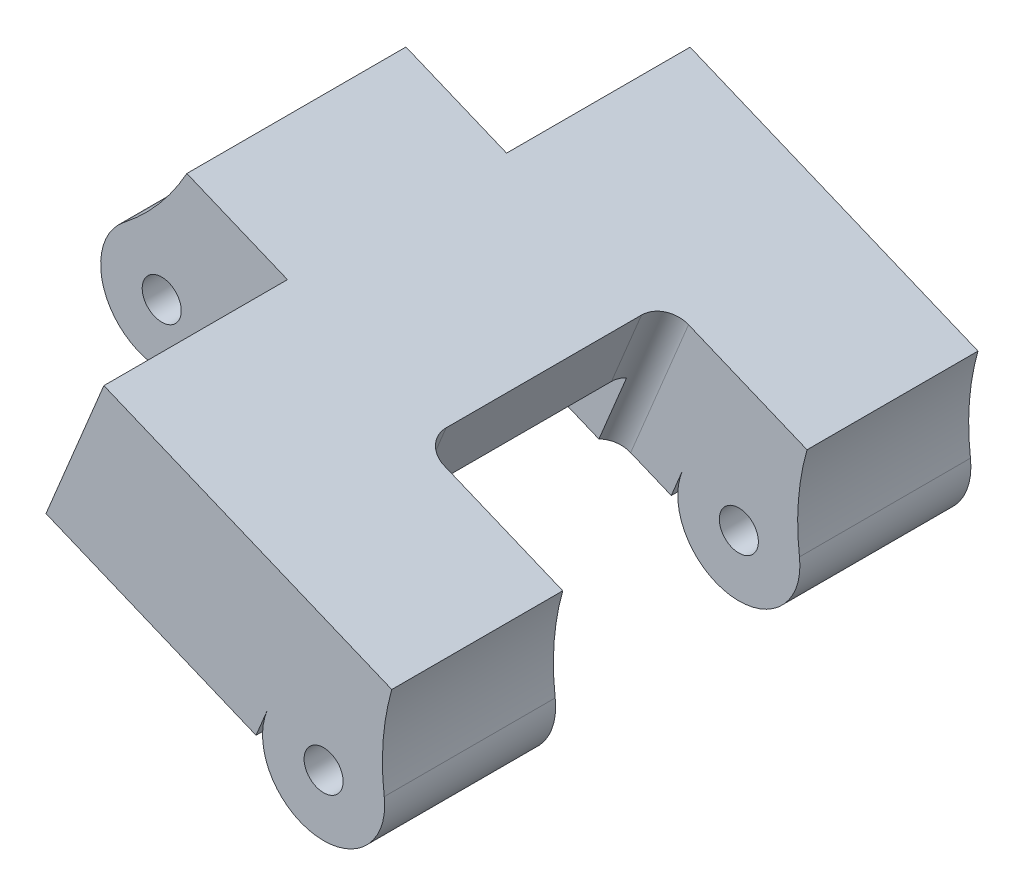
ISO-10303-21;
HEADER;
FILE_DESCRIPTION(('STEP AP214'),'2;1');
FILE_NAME('part.step','',(''),(''),'','','');
FILE_SCHEMA(('AUTOMOTIVE_DESIGN { 1 0 10303 214 1 1 1 1 }'));
ENDSEC;
DATA;
#1=APPLICATION_CONTEXT('core data for automotive mechanical design processes');
#2=APPLICATION_PROTOCOL_DEFINITION('international standard','automotive_design',2000,#1);
#3=PRODUCT_CONTEXT('',#1,'mechanical');
#4=PRODUCT('Part','Part','',(#3));
#5=PRODUCT_RELATED_PRODUCT_CATEGORY('part','',(#4));
#6=PRODUCT_DEFINITION_FORMATION('','',#4);
#7=PRODUCT_DEFINITION_CONTEXT('part definition',#1,'design');
#8=PRODUCT_DEFINITION('design','',#6,#7);
#9=PRODUCT_DEFINITION_SHAPE('','',#8);
#10=(LENGTH_UNIT() NAMED_UNIT(*) SI_UNIT(.MILLI.,.METRE.));
#11=(NAMED_UNIT(*) PLANE_ANGLE_UNIT() SI_UNIT($,.RADIAN.));
#12=(NAMED_UNIT(*) SI_UNIT($,.STERADIAN.) SOLID_ANGLE_UNIT());
#13=UNCERTAINTY_MEASURE_WITH_UNIT(LENGTH_MEASURE(1.E-05),#10,'distance_accuracy_value','');
#14=(GEOMETRIC_REPRESENTATION_CONTEXT(3) GLOBAL_UNCERTAINTY_ASSIGNED_CONTEXT((#13)) GLOBAL_UNIT_ASSIGNED_CONTEXT((#10,
#11,#12)) REPRESENTATION_CONTEXT('',''));
#15=CARTESIAN_POINT('',(0.,0.,0.));
#16=DIRECTION('',(0.,0.,1.));
#17=DIRECTION('',(1.,0.,0.));
#18=AXIS2_PLACEMENT_3D('',#15,#16,#17);
#19=CARTESIAN_POINT('',(-0.172591986233107,-0.248532460175933,-16.));
#20=DIRECTION('',(0.,0.,1.));
#21=DIRECTION('',(1.,0.,0.));
#22=AXIS2_PLACEMENT_3D('',#19,#20,#21);
#23=CYLINDRICAL_SURFACE('',#22,20.7025828439832);
#24=CARTESIAN_POINT('',(-0.172591986233206,-0.248532460176063,0.5));
#25=DIRECTION('',(0.,0.,-1.));
#26=DIRECTION('',(1.,0.,0.));
#27=AXIS2_PLACEMENT_3D('',#24,#25,#26);
#28=CIRCLE('',#27,20.7025828439833);
#29=CARTESIAN_POINT('',(3.81573033422418,20.0662459407845,0.5));
#30=VERTEX_POINT('',#29);
#31=CARTESIAN_POINT('',(10.0472090165968,17.7557060373152,0.5));
#32=VERTEX_POINT('',#31);
#33=EDGE_CURVE('E264',#30,#32,#28,.T.);
#34=ORIENTED_EDGE('',*,*,#33,.F.);
#35=DIRECTION('',(0.,0.,1.));
#36=VECTOR('',#35,1.);
#37=CARTESIAN_POINT('',(3.81573033422417,20.0662459407845,-16.));
#38=LINE('',#37,#36);
#39=CARTESIAN_POINT('',(3.81573033422417,20.0662459407845,-8.5));
#40=VERTEX_POINT('',#39);
#41=EDGE_CURVE('E299',#40,#30,#38,.T.);
#42=ORIENTED_EDGE('',*,*,#41,.F.);
#43=CARTESIAN_POINT('',(-0.172591986234314,-0.248532460179092,-8.5));
#44=DIRECTION('',(0.,0.,1.));
#45=DIRECTION('',(1.,0.,0.));
#46=AXIS2_PLACEMENT_3D('',#43,#44,#45);
#47=CIRCLE('',#46,20.7025828439865);
#48=CARTESIAN_POINT('',(10.0472090165968,17.7557060373152,-8.5));
#49=VERTEX_POINT('',#48);
#50=EDGE_CURVE('E270',#49,#40,#47,.T.);
#51=ORIENTED_EDGE('',*,*,#50,.F.);
#52=CARTESIAN_POINT('',(10.0472090165968,17.7557060373152,-8.5));
#53=CARTESIAN_POINT('',(10.0348468425671,17.7627230248372,-8.47556494491459));
#54=CARTESIAN_POINT('',(10.0233881818708,17.7692107344771,-8.45054041542161));
#55=CARTESIAN_POINT('',(10.0023496405759,17.7810999899579,-8.39945588872322));
#56=CARTESIAN_POINT('',(9.99277030420811,17.7865012211786,-8.37339559419182));
#57=CARTESIAN_POINT('',(9.96735973518549,17.8008080954167,-8.29510225224552));
#58=CARTESIAN_POINT('',(9.95428926434468,17.8081373751284,-8.24163153746031));
#59=CARTESIAN_POINT('',(9.94004860241634,17.8161144802811,-8.15667965278405));
#60=CARTESIAN_POINT('',(9.93617506017608,17.8182818492101,-8.12575053117395));
#61=CARTESIAN_POINT('',(9.93095008808091,17.8212040555584,-8.06322350599761));
#62=CARTESIAN_POINT('',(9.92963078179481,17.8219409022057,-8.03162207501034));
#63=CARTESIAN_POINT('',(9.92963074491732,17.8219415873474,-8.));
#64=B_SPLINE_CURVE_WITH_KNOTS('',3,(#52,#53,#54,#55,#56,#57,#58,#59,#60,#61,#62,#63),
.UNSPECIFIED.,.F.,.F.,(4,2,2,2,2,4),(0.,0.0847472981534116,0.169519102046933,0.33521086431693,
0.428830058402456,0.5236192036868),.UNSPECIFIED.);
#65=CARTESIAN_POINT('',(9.92963074491732,17.8219415873474,-8.));
#66=VERTEX_POINT('',#65);
#67=EDGE_CURVE('E414',#49,#66,#64,.T.);
#68=ORIENTED_EDGE('',*,*,#67,.T.);
#69=DIRECTION('',(0.,0.,1.));
#70=VECTOR('',#69,1.);
#71=CARTESIAN_POINT('',(9.92963074491732,17.8219415873474,-16.));
#72=LINE('',#71,#70);
#73=CARTESIAN_POINT('',(9.92963074491732,17.8219415873474,0.));
#74=VERTEX_POINT('',#73);
#75=EDGE_CURVE('E296',#74,#66,#72,.F.);
#76=ORIENTED_EDGE('',*,*,#75,.F.);
#77=CARTESIAN_POINT('',(9.92963074491732,17.8219415873474,0.));
#78=CARTESIAN_POINT('',(9.92963154305127,17.8219407458761,0.028268848097725));
#79=CARTESIAN_POINT('',(9.93068520822844,17.8213521357923,0.0565204675716787));
#80=CARTESIAN_POINT('',(9.93488853924816,17.8190014742105,0.112825718695898));
#81=CARTESIAN_POINT('',(9.93803876205039,17.8172391108997,0.140879295733458));
#82=CARTESIAN_POINT('',(9.95042845900294,17.8103015950477,0.223210007944532));
#83=CARTESIAN_POINT('',(9.96261005720908,17.8034745668824,0.276955869003455));
#84=CARTESIAN_POINT('',(9.98757688553737,17.7894277374939,0.358581067899168));
#85=CARTESIAN_POINT('',(9.99779496816211,17.7836703569581,0.387543206524583));
#86=CARTESIAN_POINT('',(10.020681794944,17.770742737753,0.444593669477878));
#87=CARTESIAN_POINT('',(10.0333795519744,17.763555751717,0.472666563127197));
#88=CARTESIAN_POINT('',(10.0472090165968,17.7557060373152,0.499999999999999));
#89=B_SPLINE_CURVE_WITH_KNOTS('',3,(#77,#78,#79,#80,#81,#82,#83,#84,#85,#86,#87,#88),
.UNSPECIFIED.,.F.,.F.,(4,2,2,2,2,4),(0.,0.0847465195713117,0.169515561415968,0.335205588174701,
0.42882778002787,0.523619233427886),.UNSPECIFIED.);
#90=EDGE_CURVE('E536',#74,#32,#89,.T.);
#91=ORIENTED_EDGE('',*,*,#90,.T.);
#92=EDGE_LOOP('',(#34,#42,#51,#68,#76,#91));
#93=FACE_BOUND('',#92,.T.);
#94=ADVANCED_FACE('F40',(#93),#23,.F.);
#95=CARTESIAN_POINT('',(5.03679434741886,6.00791887752144,1.));
#96=DIRECTION('',(0.,0.,1.));
#97=DIRECTION('',(1.,0.,0.));
#98=AXIS2_PLACEMENT_3D('',#95,#96,#97);
#99=PLANE('',#98);
#100=DIRECTION('',(0.923898665528031,-0.382637237910168,0.));
#101=VECTOR('',#100,1.);
#102=CARTESIAN_POINT('',(11.1589901539816,20.7902975259699,1.));
#103=LINE('',#102,#101);
#104=CARTESIAN_POINT('',(12.0828888195096,20.4076602880598,1.));
#105=VERTEX_POINT('',#104);
#106=CARTESIAN_POINT('',(16.9333568135318,18.3988147890314,1.));
#107=VERTEX_POINT('',#106);
#108=EDGE_CURVE('E309',#105,#107,#103,.T.);
#109=ORIENTED_EDGE('',*,*,#108,.T.);
#110=CARTESIAN_POINT('',(26.5503089133486,15.6576047806906,1.));
#111=DIRECTION('',(0.,0.,1.));
#112=DIRECTION('',(1.,0.,0.));
#113=AXIS2_PLACEMENT_3D('',#110,#111,#112);
#114=CIRCLE('',#113,10.);
#115=CARTESIAN_POINT('',(16.6240045962296,14.4457951405478,1.));
#116=VERTEX_POINT('',#115);
#117=EDGE_CURVE('E390',#107,#116,#114,.T.);
#118=ORIENTED_EDGE('',*,*,#117,.T.);
#119=CARTESIAN_POINT('',(14.1424285169498,14.1428427305121,1.));
#120=DIRECTION('',(0.,0.,1.));
#121=DIRECTION('',(1.,0.,0.));
#122=AXIS2_PLACEMENT_3D('',#119,#120,#121);
#123=CIRCLE('',#122,2.5);
#124=CARTESIAN_POINT('',(11.8326818531297,15.0994358252875,1.));
#125=VERTEX_POINT('',#124);
#126=EDGE_CURVE('E315',#125,#116,#123,.T.);
#127=ORIENTED_EDGE('',*,*,#126,.F.);
#128=DIRECTION('',(-0.382637237910168,-0.923898665528032,0.));
#129=VECTOR('',#128,1.);
#130=CARTESIAN_POINT('',(11.8326818531297,15.0994358252875,1.));
#131=LINE('',#130,#129);
#132=CARTESIAN_POINT('',(11.3762448195379,13.9973434922564,1.));
#133=VERTEX_POINT('',#132);
#134=EDGE_CURVE('E238',#125,#133,#131,.T.);
#135=ORIENTED_EDGE('',*,*,#134,.T.);
#136=DIRECTION('',(0.923898665528031,-0.382637237910168,0.));
#137=VECTOR('',#136,1.);
#138=CARTESIAN_POINT('',(14.5637335903891,12.6772291283601,1.));
#139=LINE('',#138,#137);
#140=CARTESIAN_POINT('',(9.71326559636697,14.6860746273885,1.));
#141=VERTEX_POINT('',#140);
#142=EDGE_CURVE('E231',#141,#133,#139,.T.);
#143=ORIENTED_EDGE('',*,*,#142,.F.);
#144=DIRECTION('',(0.382637237910168,0.923898665528031,0.));
#145=VECTOR('',#144,1.);
#146=CARTESIAN_POINT('',(12.0828888195096,20.4076602880598,1.));
#147=LINE('',#146,#145);
#148=EDGE_CURVE('E56',#141,#105,#147,.T.);
#149=ORIENTED_EDGE('',*,*,#148,.T.);
#150=EDGE_LOOP('',(#109,#118,#127,#135,#143,#149));
#151=FACE_BOUND('',#150,.T.);
#152=CARTESIAN_POINT('',(14.1424285169498,14.1428427305121,1.));
#153=DIRECTION('',(0.,0.,1.));
#154=DIRECTION('',(1.,0.,0.));
#155=AXIS2_PLACEMENT_3D('',#152,#153,#154);
#156=CIRCLE('',#155,0.800000000000001);
#157=CARTESIAN_POINT('',(14.9424285169498,14.1428427305121,1.));
#158=VERTEX_POINT('',#157);
#159=EDGE_CURVE('E314',#158,#158,#156,.T.);
#160=ORIENTED_EDGE('',*,*,#159,.T.);
#161=EDGE_LOOP('',(#160));
#162=FACE_BOUND('',#161,.T.);
#163=ADVANCED_FACE('F488',(#151,#162),#99,.F.);
#164=CARTESIAN_POINT('',(5.03679434741886,6.00791887752144,-9.));
#165=DIRECTION('',(0.,0.,-1.));
#166=DIRECTION('',(-1.,0.,0.));
#167=AXIS2_PLACEMENT_3D('',#164,#165,#166);
#168=PLANE('',#167);
#169=CARTESIAN_POINT('',(26.5503089133486,15.6576047806906,-9.));
#170=DIRECTION('',(0.,0.,-1.));
#171=DIRECTION('',(-1.,0.,0.));
#172=AXIS2_PLACEMENT_3D('',#169,#170,#171);
#173=CIRCLE('',#172,10.);
#174=CARTESIAN_POINT('',(16.6240045962296,14.4457951405478,-9.));
#175=VERTEX_POINT('',#174);
#176=CARTESIAN_POINT('',(16.9333568135318,18.3988147890314,-9.));
#177=VERTEX_POINT('',#176);
#178=EDGE_CURVE('E397',#175,#177,#173,.T.);
#179=ORIENTED_EDGE('',*,*,#178,.T.);
#180=DIRECTION('',(-0.923898665528031,0.382637237910168,0.));
#181=VECTOR('',#180,1.);
#182=CARTESIAN_POINT('',(11.1589901539816,20.7902975259699,-9.));
#183=LINE('',#182,#181);
#184=CARTESIAN_POINT('',(12.0828888195096,20.4076602880598,-9.));
#185=VERTEX_POINT('',#184);
#186=EDGE_CURVE('E213',#177,#185,#183,.T.);
#187=ORIENTED_EDGE('',*,*,#186,.T.);
#188=DIRECTION('',(0.382637237910168,0.923898665528031,0.));
#189=VECTOR('',#188,1.);
#190=CARTESIAN_POINT('',(10.1697026299587,15.7881669604196,-9.));
#191=LINE('',#190,#189);
#192=CARTESIAN_POINT('',(9.71326559636697,14.6860746273885,-9.));
#193=VERTEX_POINT('',#192);
#194=EDGE_CURVE('E208',#185,#193,#191,.F.);
#195=ORIENTED_EDGE('',*,*,#194,.T.);
#196=DIRECTION('',(-0.923898665528031,0.382637237910168,0.));
#197=VECTOR('',#196,1.);
#198=CARTESIAN_POINT('',(9.71326559636697,14.6860746273885,-9.));
#199=LINE('',#198,#197);
#200=CARTESIAN_POINT('',(11.3762448195379,13.9973434922564,-9.));
#201=VERTEX_POINT('',#200);
#202=EDGE_CURVE('E63',#201,#193,#199,.T.);
#203=ORIENTED_EDGE('',*,*,#202,.F.);
#204=DIRECTION('',(0.382637237910168,0.923898665528032,0.));
#205=VECTOR('',#204,1.);
#206=CARTESIAN_POINT('',(11.3762448195379,13.9973434922564,-9.));
#207=LINE('',#206,#205);
#208=CARTESIAN_POINT('',(11.8326818531297,15.0994358252875,-9.));
#209=VERTEX_POINT('',#208);
#210=EDGE_CURVE('E11',#201,#209,#207,.T.);
#211=ORIENTED_EDGE('',*,*,#210,.T.);
#212=CARTESIAN_POINT('',(14.1424285169498,14.1428427305121,-9.));
#213=DIRECTION('',(0.,0.,-1.));
#214=DIRECTION('',(-1.,0.,0.));
#215=AXIS2_PLACEMENT_3D('',#212,#213,#214);
#216=CIRCLE('',#215,2.5);
#217=EDGE_CURVE('E312',#175,#209,#216,.T.);
#218=ORIENTED_EDGE('',*,*,#217,.F.);
#219=EDGE_LOOP('',(#179,#187,#195,#203,#211,#218));
#220=FACE_BOUND('',#219,.T.);
#221=CARTESIAN_POINT('',(14.1424285169498,14.1428427305121,-9.));
#222=DIRECTION('',(0.,0.,-1.));
#223=DIRECTION('',(-1.,0.,0.));
#224=AXIS2_PLACEMENT_3D('',#221,#222,#223);
#225=CIRCLE('',#224,0.800000000000001);
#226=CARTESIAN_POINT('',(13.3424285169498,14.1428427305121,-9.));
#227=VERTEX_POINT('',#226);
#228=EDGE_CURVE('E311',#227,#227,#225,.T.);
#229=ORIENTED_EDGE('',*,*,#228,.T.);
#230=EDGE_LOOP('',(#229));
#231=FACE_BOUND('',#230,.T.);
#232=ADVANCED_FACE('F210',(#220,#231),#168,.F.);
#233=CARTESIAN_POINT('',(14.1424285169498,14.1428427305121,8.));
#234=DIRECTION('',(0.,0.,-1.));
#235=DIRECTION('',(-1.,0.,0.));
#236=AXIS2_PLACEMENT_3D('',#233,#234,#235);
#237=CYLINDRICAL_SURFACE('',#236,2.5);
#238=ORIENTED_EDGE('',*,*,#126,.T.);
#239=DIRECTION('',(0.,0.,-1.));
#240=VECTOR('',#239,1.);
#241=CARTESIAN_POINT('',(16.6240045962296,14.4457951405478,8.));
#242=LINE('',#241,#240);
#243=CARTESIAN_POINT('',(16.6240045962296,14.4457951405478,8.));
#244=VERTEX_POINT('',#243);
#245=EDGE_CURVE('E379',#116,#244,#242,.F.);
#246=ORIENTED_EDGE('',*,*,#245,.T.);
#247=CARTESIAN_POINT('',(14.1424285169498,14.1428427305121,8.));
#248=DIRECTION('',(0.,0.,1.));
#249=DIRECTION('',(1.,0.,0.));
#250=AXIS2_PLACEMENT_3D('',#247,#248,#249);
#251=CIRCLE('',#250,2.5);
#252=CARTESIAN_POINT('',(11.8326818531297,15.0994358252875,8.));
#253=VERTEX_POINT('',#252);
#254=EDGE_CURVE('E350',#253,#244,#251,.T.);
#255=ORIENTED_EDGE('',*,*,#254,.F.);
#256=DIRECTION('',(0.,0.,-1.));
#257=VECTOR('',#256,1.);
#258=CARTESIAN_POINT('',(11.8326818531297,15.0994358252875,8.));
#259=LINE('',#258,#257);
#260=EDGE_CURVE('E366',#253,#125,#259,.T.);
#261=ORIENTED_EDGE('',*,*,#260,.T.);
#262=EDGE_LOOP('',(#238,#246,#255,#261));
#263=FACE_BOUND('',#262,.T.);
#264=ADVANCED_FACE('F460',(#263),#237,.T.);
#265=CARTESIAN_POINT('',(14.1424285169498,14.1428427305121,8.));
#266=DIRECTION('',(0.,0.,-1.));
#267=DIRECTION('',(-1.,0.,0.));
#268=AXIS2_PLACEMENT_3D('',#265,#266,#267);
#269=CYLINDRICAL_SURFACE('',#268,0.800000000000001);
#270=ORIENTED_EDGE('',*,*,#159,.F.);
#271=EDGE_LOOP('',(#270));
#272=FACE_BOUND('',#271,.T.);
#273=CARTESIAN_POINT('',(14.1424285169498,14.1428427305121,8.));
#274=DIRECTION('',(0.,0.,1.));
#275=DIRECTION('',(1.,0.,0.));
#276=AXIS2_PLACEMENT_3D('',#273,#274,#275);
#277=CIRCLE('',#276,0.800000000000001);
#278=CARTESIAN_POINT('',(14.9424285169498,14.1428427305121,8.));
#279=VERTEX_POINT('',#278);
#280=EDGE_CURVE('E347',#279,#279,#277,.T.);
#281=ORIENTED_EDGE('',*,*,#280,.T.);
#282=EDGE_LOOP('',(#281));
#283=FACE_BOUND('',#282,.T.);
#284=ADVANCED_FACE('F450',(#272,#283),#269,.F.);
#285=CARTESIAN_POINT('',(14.1424285169498,14.1428427305121,-16.));
#286=DIRECTION('',(0.,0.,1.));
#287=DIRECTION('',(1.,0.,0.));
#288=AXIS2_PLACEMENT_3D('',#285,#286,#287);
#289=CIRCLE('',#288,2.5);
#290=CARTESIAN_POINT('',(11.8326818531297,15.0994358252875,-16.));
#291=VERTEX_POINT('',#290);
#292=CARTESIAN_POINT('',(16.6240045962296,14.4457951405478,-16.));
#293=VERTEX_POINT('',#292);
#294=EDGE_CURVE('E341',#291,#293,#289,.T.);
#295=ORIENTED_EDGE('',*,*,#294,.T.);
#296=DIRECTION('',(0.,0.,-1.));
#297=VECTOR('',#296,1.);
#298=CARTESIAN_POINT('',(16.6240045962296,14.4457951405478,8.));
#299=LINE('',#298,#297);
#300=EDGE_CURVE('E385',#293,#175,#299,.F.);
#301=ORIENTED_EDGE('',*,*,#300,.T.);
#302=ORIENTED_EDGE('',*,*,#217,.T.);
#303=EDGE_CURVE('E365',#209,#291,#259,.T.);
#304=ORIENTED_EDGE('',*,*,#303,.T.);
#305=EDGE_LOOP('',(#295,#301,#302,#304));
#306=FACE_BOUND('',#305,.T.);
#307=ADVANCED_FACE('F456',(#306),#237,.T.);
#308=CARTESIAN_POINT('',(8.98354685928157,21.6912682109297,8.));
#309=DIRECTION('',(0.382637237910168,0.923898665528031,0.));
#310=DIRECTION('',(-0.923898665528031,0.382637237910168,0.));
#311=AXIS2_PLACEMENT_3D('',#308,#309,#310);
#312=PLANE('',#311);
#313=ORIENTED_EDGE('',*,*,#108,.F.);
#314=CARTESIAN_POINT('',(12.0828888195096,20.4076602880598,0.));
#315=DIRECTION('',(0.382637237910168,0.923898665528031,0.));
#316=DIRECTION('',(-0.923898665528031,0.382637237910168,0.));
#317=AXIS2_PLACEMENT_3D('',#314,#315,#316);
#318=CIRCLE('',#317,1.);
#319=CARTESIAN_POINT('',(11.1589901539816,20.7902975259699,0.));
#320=VERTEX_POINT('',#319);
#321=EDGE_CURVE('E421',#105,#320,#318,.F.);
#322=ORIENTED_EDGE('',*,*,#321,.T.);
#323=DIRECTION('',(0.,0.,1.));
#324=VECTOR('',#323,1.);
#325=CARTESIAN_POINT('',(11.1589901539816,20.7902975259699,1.));
#326=LINE('',#325,#324);
#327=CARTESIAN_POINT('',(11.1589901539816,20.7902975259699,-8.));
#328=VERTEX_POINT('',#327);
#329=EDGE_CURVE('E306',#328,#320,#326,.T.);
#330=ORIENTED_EDGE('',*,*,#329,.F.);
#331=CARTESIAN_POINT('',(12.0828888195096,20.4076602880598,-8.));
#332=DIRECTION('',(0.382637237910168,0.923898665528031,0.));
#333=DIRECTION('',(-0.923898665528031,0.382637237910168,0.));
#334=AXIS2_PLACEMENT_3D('',#331,#332,#333);
#335=CIRCLE('',#334,1.);
#336=EDGE_CURVE('E411',#328,#185,#335,.F.);
#337=ORIENTED_EDGE('',*,*,#336,.T.);
#338=ORIENTED_EDGE('',*,*,#186,.F.);
#339=DIRECTION('',(0.,0.,-1.));
#340=VECTOR('',#339,1.);
#341=CARTESIAN_POINT('',(16.9333568135318,18.3988147890314,8.));
#342=LINE('',#341,#340);
#343=CARTESIAN_POINT('',(16.9333568135318,18.3988147890314,-16.));
#344=VERTEX_POINT('',#343);
#345=EDGE_CURVE('E361',#177,#344,#342,.T.);
#346=ORIENTED_EDGE('',*,*,#345,.T.);
#347=DIRECTION('',(0.923898665528032,-0.382637237910168,0.));
#348=VECTOR('',#347,1.);
#349=CARTESIAN_POINT('',(8.98354685928157,21.6912682109297,-16.));
#350=LINE('',#349,#348);
#351=CARTESIAN_POINT('',(5.14683151889894,23.2802629949546,-16.));
#352=VERTEX_POINT('',#351);
#353=EDGE_CURVE('E344',#352,#344,#350,.T.);
#354=ORIENTED_EDGE('',*,*,#353,.F.);
#355=DIRECTION('',(0.,0.,-1.));
#356=VECTOR('',#355,1.);
#357=CARTESIAN_POINT('',(5.14683151889895,23.2802629949546,-16.));
#358=LINE('',#357,#356);
#359=CARTESIAN_POINT('',(5.14683151889895,23.2802629949546,-8.48506014245602));
#360=VERTEX_POINT('',#359);
#361=EDGE_CURVE('E317',#360,#352,#358,.T.);
#362=ORIENTED_EDGE('',*,*,#361,.F.);
#363=DIRECTION('',(0.923898665528031,-0.382637237910168,0.));
#364=VECTOR('',#363,1.);
#365=CARTESIAN_POINT('',(5.14683151889895,23.2802629949546,-8.48506014245602));
#366=LINE('',#365,#364);
#367=CARTESIAN_POINT('',(1.0293911058345,24.985521467229,-8.48506014245602));
#368=VERTEX_POINT('',#367);
#369=EDGE_CURVE('E329',#368,#360,#366,.T.);
#370=ORIENTED_EDGE('',*,*,#369,.F.);
#371=DIRECTION('',(0.,0.,-1.));
#372=VECTOR('',#371,1.);
#373=CARTESIAN_POINT('',(1.02939110583451,24.985521467229,8.));
#374=LINE('',#373,#372);
#375=CARTESIAN_POINT('',(1.0293911058345,24.985521467229,0.485060142456018));
#376=VERTEX_POINT('',#375);
#377=EDGE_CURVE('E358',#376,#368,#374,.T.);
#378=ORIENTED_EDGE('',*,*,#377,.F.);
#379=DIRECTION('',(-0.923898665528031,0.382637237910168,0.));
#380=VECTOR('',#379,1.);
#381=CARTESIAN_POINT('',(5.14683151889895,23.2802629949546,0.485060142456017));
#382=LINE('',#381,#380);
#383=CARTESIAN_POINT('',(5.14683151889895,23.2802629949546,0.485060142456017));
#384=VERTEX_POINT('',#383);
#385=EDGE_CURVE('E321',#384,#376,#382,.T.);
#386=ORIENTED_EDGE('',*,*,#385,.F.);
#387=DIRECTION('',(0.,0.,-1.));
#388=VECTOR('',#387,1.);
#389=CARTESIAN_POINT('',(5.14683151889895,23.2802629949546,8.));
#390=LINE('',#389,#388);
#391=CARTESIAN_POINT('',(5.14683151889895,23.2802629949546,8.));
#392=VERTEX_POINT('',#391);
#393=EDGE_CURVE('E318',#392,#384,#390,.T.);
#394=ORIENTED_EDGE('',*,*,#393,.F.);
#395=DIRECTION('',(0.923898665528032,-0.382637237910168,0.));
#396=VECTOR('',#395,1.);
#397=CARTESIAN_POINT('',(8.98354685928157,21.6912682109297,8.));
#398=LINE('',#397,#396);
#399=CARTESIAN_POINT('',(16.9333568135318,18.3988147890314,8.));
#400=VERTEX_POINT('',#399);
#401=EDGE_CURVE('E353',#392,#400,#398,.T.);
#402=ORIENTED_EDGE('',*,*,#401,.T.);
#403=EDGE_CURVE('E362',#400,#107,#342,.T.);
#404=ORIENTED_EDGE('',*,*,#403,.T.);
#405=EDGE_LOOP('',(#313,#322,#330,#337,#338,#346,#354,#362,#370,#378,#386,#394,#402,#404));
#406=FACE_BOUND('',#405,.T.);
#407=ADVANCED_FACE('F448',(#406),#312,.T.);
#408=ORIENTED_EDGE('',*,*,#228,.F.);
#409=EDGE_LOOP('',(#408));
#410=FACE_BOUND('',#409,.T.);
#411=CARTESIAN_POINT('',(14.1424285169498,14.1428427305121,-16.));
#412=DIRECTION('',(0.,0.,1.));
#413=DIRECTION('',(1.,0.,0.));
#414=AXIS2_PLACEMENT_3D('',#411,#412,#413);
#415=CIRCLE('',#414,0.800000000000001);
#416=CARTESIAN_POINT('',(14.9424285169498,14.1428427305121,-16.));
#417=VERTEX_POINT('',#416);
#418=EDGE_CURVE('E338',#417,#417,#415,.T.);
#419=ORIENTED_EDGE('',*,*,#418,.F.);
#420=EDGE_LOOP('',(#419));
#421=FACE_BOUND('',#420,.T.);
#422=ADVANCED_FACE('F444',(#410,#421),#269,.F.);
#423=CARTESIAN_POINT('',(0.,20.,8.));
#424=DIRECTION('',(0.,0.,-1.));
#425=DIRECTION('',(-1.,0.,0.));
#426=AXIS2_PLACEMENT_3D('',#423,#424,#425);
#427=CYLINDRICAL_SURFACE('',#426,2.5);
#428=CARTESIAN_POINT('',(0.,20.,0.485060142456018));
#429=DIRECTION('',(0.,0.,-1.));
#430=DIRECTION('',(-1.,0.,0.));
#431=AXIS2_PLACEMENT_3D('',#428,#429,#430);
#432=CIRCLE('',#431,2.5);
#433=CARTESIAN_POINT('',(2.30974666382008,19.0434069052246,0.485060142456018));
#434=VERTEX_POINT('',#433);
#435=CARTESIAN_POINT('',(-1.5433525212549,21.9667391782176,0.485060142456018));
#436=VERTEX_POINT('',#435);
#437=EDGE_CURVE('E376',#434,#436,#432,.T.);
#438=ORIENTED_EDGE('',*,*,#437,.T.);
#439=DIRECTION('',(0.,0.,-1.));
#440=VECTOR('',#439,1.);
#441=CARTESIAN_POINT('',(-1.5433525212549,21.9667391782176,8.));
#442=LINE('',#441,#440);
#443=CARTESIAN_POINT('',(-1.5433525212549,21.9667391782176,-8.48506014245602));
#444=VERTEX_POINT('',#443);
#445=EDGE_CURVE('E387',#436,#444,#442,.T.);
#446=ORIENTED_EDGE('',*,*,#445,.T.);
#447=CARTESIAN_POINT('',(0.,20.,-8.48506014245602));
#448=DIRECTION('',(0.,0.,1.));
#449=DIRECTION('',(1.,0.,0.));
#450=AXIS2_PLACEMENT_3D('',#447,#448,#449);
#451=CIRCLE('',#450,2.5);
#452=CARTESIAN_POINT('',(2.30974666382008,19.0434069052246,-8.48506014245602));
#453=VERTEX_POINT('',#452);
#454=EDGE_CURVE('E373',#444,#453,#451,.T.);
#455=ORIENTED_EDGE('',*,*,#454,.T.);
#456=DIRECTION('',(0.,0.,-1.));
#457=VECTOR('',#456,1.);
#458=CARTESIAN_POINT('',(2.30974666382008,19.0434069052246,8.));
#459=LINE('',#458,#457);
#460=EDGE_CURVE('E356',#434,#453,#459,.T.);
#461=ORIENTED_EDGE('',*,*,#460,.F.);
#462=EDGE_LOOP('',(#438,#446,#455,#461));
#463=FACE_BOUND('',#462,.T.);
#464=ADVANCED_FACE('F447',(#463),#427,.T.);
#465=CARTESIAN_POINT('',(0.,0.,8.));
#466=DIRECTION('',(0.,0.,1.));
#467=DIRECTION('',(1.,0.,0.));
#468=AXIS2_PLACEMENT_3D('',#465,#466,#467);
#469=PLANE('',#468);
#470=DIRECTION('',(0.382637237910168,0.923898665528031,0.));
#471=VECTOR('',#470,1.);
#472=CARTESIAN_POINT('',(-3.83671534038262,1.58899478402487,8.));
#473=LINE('',#472,#471);
#474=CARTESIAN_POINT('',(2.77720829575634,17.5586773342833,8.));
#475=VERTEX_POINT('',#474);
#476=EDGE_CURVE('E371',#475,#392,#473,.T.);
#477=ORIENTED_EDGE('',*,*,#476,.F.);
#478=DIRECTION('',(0.923898665528032,-0.382637237910168,0.));
#479=VECTOR('',#478,1.);
#480=CARTESIAN_POINT('',(11.3762448195379,13.9973434922564,8.));
#481=LINE('',#480,#479);
#482=CARTESIAN_POINT('',(11.3762448195379,13.9973434922564,8.));
#483=VERTEX_POINT('',#482);
#484=EDGE_CURVE('E251',#475,#483,#481,.T.);
#485=ORIENTED_EDGE('',*,*,#484,.T.);
#486=DIRECTION('',(0.382637237910168,0.923898665528031,0.));
#487=VECTOR('',#486,1.);
#488=CARTESIAN_POINT('',(11.8326818531297,15.0994358252875,8.));
#489=LINE('',#488,#487);
#490=EDGE_CURVE('E257',#483,#253,#489,.T.);
#491=ORIENTED_EDGE('',*,*,#490,.T.);
#492=ORIENTED_EDGE('',*,*,#254,.T.);
#493=CARTESIAN_POINT('',(26.5503089133486,15.6576047806906,8.));
#494=DIRECTION('',(0.,0.,1.));
#495=DIRECTION('',(1.,0.,0.));
#496=AXIS2_PLACEMENT_3D('',#493,#494,#495);
#497=CIRCLE('',#496,10.);
#498=EDGE_CURVE('E393',#244,#400,#497,.F.);
#499=ORIENTED_EDGE('',*,*,#498,.T.);
#500=ORIENTED_EDGE('',*,*,#401,.F.);
#501=EDGE_LOOP('',(#477,#485,#491,#492,#499,#500));
#502=FACE_BOUND('',#501,.T.);
#503=ORIENTED_EDGE('',*,*,#280,.F.);
#504=EDGE_LOOP('',(#503));
#505=FACE_BOUND('',#504,.T.);
#506=ADVANCED_FACE('F466',(#502,#505),#469,.T.);
#507=CARTESIAN_POINT('',(0.,0.,-16.));
#508=DIRECTION('',(0.,0.,1.));
#509=DIRECTION('',(1.,0.,0.));
#510=AXIS2_PLACEMENT_3D('',#507,#508,#509);
#511=PLANE('',#510);
#512=ORIENTED_EDGE('',*,*,#294,.F.);
#513=DIRECTION('',(-0.382637237910168,-0.923898665528031,0.));
#514=VECTOR('',#513,1.);
#515=CARTESIAN_POINT('',(11.3762448195379,13.9973434922564,-16.));
#516=LINE('',#515,#514);
#517=CARTESIAN_POINT('',(11.3762448195379,13.9973434922564,-16.));
#518=VERTEX_POINT('',#517);
#519=EDGE_CURVE('E240',#291,#518,#516,.T.);
#520=ORIENTED_EDGE('',*,*,#519,.T.);
#521=DIRECTION('',(-0.923898665528032,0.382637237910168,0.));
#522=VECTOR('',#521,1.);
#523=CARTESIAN_POINT('',(2.77720829575634,17.5586773342833,-16.));
#524=LINE('',#523,#522);
#525=CARTESIAN_POINT('',(2.77720829575634,17.5586773342833,-16.));
#526=VERTEX_POINT('',#525);
#527=EDGE_CURVE('E243',#518,#526,#524,.T.);
#528=ORIENTED_EDGE('',*,*,#527,.T.);
#529=DIRECTION('',(0.382637237910168,0.923898665528032,0.));
#530=VECTOR('',#529,1.);
#531=CARTESIAN_POINT('',(-3.83671534038262,1.58899478402487,-16.));
#532=LINE('',#531,#530);
#533=EDGE_CURVE('E369',#526,#352,#532,.T.);
#534=ORIENTED_EDGE('',*,*,#533,.T.);
#535=ORIENTED_EDGE('',*,*,#353,.T.);
#536=CARTESIAN_POINT('',(26.5503089133486,15.6576047806906,-16.));
#537=DIRECTION('',(0.,0.,1.));
#538=DIRECTION('',(1.,0.,0.));
#539=AXIS2_PLACEMENT_3D('',#536,#537,#538);
#540=CIRCLE('',#539,10.);
#541=EDGE_CURVE('E395',#344,#293,#540,.T.);
#542=ORIENTED_EDGE('',*,*,#541,.T.);
#543=EDGE_LOOP('',(#512,#520,#528,#534,#535,#542));
#544=FACE_BOUND('',#543,.T.);
#545=ORIENTED_EDGE('',*,*,#418,.T.);
#546=EDGE_LOOP('',(#545));
#547=FACE_BOUND('',#546,.T.);
#548=ADVANCED_FACE('F470',(#544,#547),#511,.F.);
#549=CARTESIAN_POINT('',(-0.975364287663745,8.49788434650607,-8.48506014245602));
#550=DIRECTION('',(0.,0.,1.));
#551=DIRECTION('',(1.,0.,0.));
#552=AXIS2_PLACEMENT_3D('',#549,#550,#551);
#553=PLANE('',#552);
#554=CARTESIAN_POINT('',(0.,20.,-8.48506014245602));
#555=DIRECTION('',(0.,0.,1.));
#556=DIRECTION('',(1.,0.,0.));
#557=AXIS2_PLACEMENT_3D('',#554,#555,#556);
#558=CIRCLE('',#557,0.8);
#559=CARTESIAN_POINT('',(0.8,20.,-8.48506014245602));
#560=VERTEX_POINT('',#559);
#561=EDGE_CURVE('E326',#560,#560,#558,.T.);
#562=ORIENTED_EDGE('',*,*,#561,.T.);
#563=EDGE_LOOP('',(#562));
#564=FACE_BOUND('',#563,.T.);
#565=DIRECTION('',(0.382637237910168,0.923898665528031,0.));
#566=VECTOR('',#565,1.);
#567=CARTESIAN_POINT('',(-0.975364287663745,8.49788434650607,-8.48506014245602));
#568=LINE('',#567,#566);
#569=CARTESIAN_POINT('',(3.82091485928022,20.0787642618105,-8.48506014245602));
#570=VERTEX_POINT('',#569);
#571=EDGE_CURVE('E322',#570,#360,#568,.T.);
#572=ORIENTED_EDGE('',*,*,#571,.F.);
#573=DIRECTION('',(-0.985738303977983,0.168285460068925,0.));
#574=VECTOR('',#573,1.);
#575=CARTESIAN_POINT('',(1.08156549388773,20.5464265879921,-8.48506014245602));
#576=LINE('',#575,#574);
#577=CARTESIAN_POINT('',(2.80483549489875,20.2522295543851,-8.48506014245602));
#578=VERTEX_POINT('',#577);
#579=EDGE_CURVE('E290',#570,#578,#576,.T.);
#580=ORIENTED_EDGE('',*,*,#579,.T.);
#581=DIRECTION('',(-3.62386926633694E-12,-1.,0.));
#582=VECTOR('',#581,1.);
#583=CARTESIAN_POINT('',(2.80483549485615,8.49788434649237,-8.48506014245602));
#584=LINE('',#583,#582);
#585=CARTESIAN_POINT('',(2.8048354948987,20.2388261301008,-8.48506014245602));
#586=VERTEX_POINT('',#585);
#587=EDGE_CURVE('E284',#578,#586,#584,.T.);
#588=ORIENTED_EDGE('',*,*,#587,.T.);
#589=DIRECTION('',(-0.38263723791017,-0.923898665528031,0.));
#590=VECTOR('',#589,1.);
#591=CARTESIAN_POINT('',(-1.89926295319179,8.88052158441624,-8.48506014245602));
#592=LINE('',#591,#590);
#593=EDGE_CURVE('E302',#586,#453,#592,.T.);
#594=ORIENTED_EDGE('',*,*,#593,.T.);
#595=ORIENTED_EDGE('',*,*,#454,.F.);
#596=CARTESIAN_POINT('',(-7.71676260627448,29.8336958910882,-8.48506014245602));
#597=DIRECTION('',(0.,0.,1.));
#598=DIRECTION('',(1.,0.,0.));
#599=AXIS2_PLACEMENT_3D('',#596,#597,#598);
#600=CIRCLE('',#599,10.);
#601=EDGE_CURVE('E399',#444,#368,#600,.T.);
#602=ORIENTED_EDGE('',*,*,#601,.T.);
#603=ORIENTED_EDGE('',*,*,#369,.T.);
#604=EDGE_LOOP('',(#572,#580,#588,#594,#595,#602,#603));
#605=FACE_BOUND('',#604,.T.);
#606=ADVANCED_FACE('F474',(#564,#605),#553,.F.);
#607=CARTESIAN_POINT('',(-0.975364287663745,8.49788434650607,0.485060142456017));
#608=DIRECTION('',(0.,0.,-1.));
#609=DIRECTION('',(-1.,0.,0.));
#610=AXIS2_PLACEMENT_3D('',#607,#608,#609);
#611=PLANE('',#610);
#612=CARTESIAN_POINT('',(0.,20.,0.485060142456018));
#613=DIRECTION('',(0.,0.,-1.));
#614=DIRECTION('',(-1.,0.,0.));
#615=AXIS2_PLACEMENT_3D('',#612,#613,#614);
#616=CIRCLE('',#615,0.8);
#617=CARTESIAN_POINT('',(-0.8,20.,0.485060142456018));
#618=VERTEX_POINT('',#617);
#619=EDGE_CURVE('E335',#618,#618,#616,.T.);
#620=ORIENTED_EDGE('',*,*,#619,.T.);
#621=EDGE_LOOP('',(#620));
#622=FACE_BOUND('',#621,.T.);
#623=DIRECTION('',(3.62386926633694E-12,1.,0.));
#624=VECTOR('',#623,1.);
#625=CARTESIAN_POINT('',(2.80483549485615,8.49788434649237,0.485060142456016));
#626=LINE('',#625,#624);
#627=CARTESIAN_POINT('',(2.8048354948987,20.2388261301008,0.485060142456022));
#628=VERTEX_POINT('',#627);
#629=CARTESIAN_POINT('',(2.80483549489875,20.2522295543851,0.485060142456017));
#630=VERTEX_POINT('',#629);
#631=EDGE_CURVE('E279',#628,#630,#626,.T.);
#632=ORIENTED_EDGE('',*,*,#631,.T.);
#633=DIRECTION('',(0.985738303977983,-0.168285460068925,0.));
#634=VECTOR('',#633,1.);
#635=CARTESIAN_POINT('',(1.08156549388773,20.5464265879921,0.485060142456017));
#636=LINE('',#635,#634);
#637=CARTESIAN_POINT('',(3.82091485928022,20.0787642618105,0.485060142456016));
#638=VERTEX_POINT('',#637);
#639=EDGE_CURVE('E287',#630,#638,#636,.T.);
#640=ORIENTED_EDGE('',*,*,#639,.T.);
#641=DIRECTION('',(0.382637237910168,0.923898665528031,0.));
#642=VECTOR('',#641,1.);
#643=CARTESIAN_POINT('',(-0.975364287663745,8.49788434650607,0.485060142456017));
#644=LINE('',#643,#642);
#645=EDGE_CURVE('E324',#638,#384,#644,.T.);
#646=ORIENTED_EDGE('',*,*,#645,.T.);
#647=ORIENTED_EDGE('',*,*,#385,.T.);
#648=CARTESIAN_POINT('',(-7.71676260627448,29.8336958910882,0.485060142456019));
#649=DIRECTION('',(0.,0.,-1.));
#650=DIRECTION('',(-1.,0.,0.));
#651=AXIS2_PLACEMENT_3D('',#648,#649,#650);
#652=CIRCLE('',#651,10.);
#653=EDGE_CURVE('E401',#376,#436,#652,.T.);
#654=ORIENTED_EDGE('',*,*,#653,.T.);
#655=ORIENTED_EDGE('',*,*,#437,.F.);
#656=DIRECTION('',(0.38263723791017,0.923898665528031,0.));
#657=VECTOR('',#656,1.);
#658=CARTESIAN_POINT('',(-1.89926295319179,8.88052158441624,0.485060142456017));
#659=LINE('',#658,#657);
#660=EDGE_CURVE('E403',#434,#628,#659,.T.);
#661=ORIENTED_EDGE('',*,*,#660,.T.);
#662=EDGE_LOOP('',(#632,#640,#646,#647,#654,#655,#661));
#663=FACE_BOUND('',#662,.T.);
#664=ADVANCED_FACE('F478',(#622,#663),#611,.F.);
#665=CARTESIAN_POINT('',(-0.975364287663745,8.49788434650607,8.));
#666=DIRECTION('',(0.923898665528031,-0.382637237910168,0.));
#667=DIRECTION('',(0.382637237910168,0.923898665528031,0.));
#668=AXIS2_PLACEMENT_3D('',#665,#666,#667);
#669=PLANE('',#668);
#670=DIRECTION('',(-0.382637237910169,-0.923898665528031,0.));
#671=VECTOR('',#670,1.);
#672=CARTESIAN_POINT('',(3.23364532934811,18.6607696673144,-8.5));
#673=LINE('',#672,#671);
#674=CARTESIAN_POINT('',(2.77720829575634,17.5586773342833,-8.5));
#675=VERTEX_POINT('',#674);
#676=EDGE_CURVE('E272',#40,#675,#673,.T.);
#677=ORIENTED_EDGE('',*,*,#676,.F.);
#678=ORIENTED_EDGE('',*,*,#41,.T.);
#679=DIRECTION('',(0.382637237910168,0.923898665528032,0.));
#680=VECTOR('',#679,1.);
#681=CARTESIAN_POINT('',(3.23364532934811,18.6607696673144,0.5));
#682=LINE('',#681,#680);
#683=CARTESIAN_POINT('',(2.77720829575634,17.5586773342833,0.5));
#684=VERTEX_POINT('',#683);
#685=EDGE_CURVE('E268',#684,#30,#682,.T.);
#686=ORIENTED_EDGE('',*,*,#685,.F.);
#687=DIRECTION('',(0.,0.,1.));
#688=VECTOR('',#687,1.);
#689=CARTESIAN_POINT('',(2.77720829575634,17.5586773342833,0.5));
#690=LINE('',#689,#688);
#691=EDGE_CURVE('E256',#684,#475,#690,.T.);
#692=ORIENTED_EDGE('',*,*,#691,.T.);
#693=ORIENTED_EDGE('',*,*,#476,.T.);
#694=ORIENTED_EDGE('',*,*,#393,.T.);
#695=ORIENTED_EDGE('',*,*,#645,.F.);
#696=DIRECTION('',(0.,0.,-1.));
#697=VECTOR('',#696,1.);
#698=CARTESIAN_POINT('',(3.82091485928022,20.0787642618105,8.));
#699=LINE('',#698,#697);
#700=EDGE_CURVE('E276',#638,#570,#699,.T.);
#701=ORIENTED_EDGE('',*,*,#700,.T.);
#702=ORIENTED_EDGE('',*,*,#571,.T.);
#703=ORIENTED_EDGE('',*,*,#361,.T.);
#704=ORIENTED_EDGE('',*,*,#533,.F.);
#705=DIRECTION('',(0.,0.,-1.));
#706=VECTOR('',#705,1.);
#707=CARTESIAN_POINT('',(2.77720829575634,17.5586773342833,-8.5));
#708=LINE('',#707,#706);
#709=EDGE_CURVE('E248',#675,#526,#708,.T.);
#710=ORIENTED_EDGE('',*,*,#709,.F.);
#711=EDGE_LOOP('',(#677,#678,#686,#692,#693,#694,#695,#701,#702,#703,#704,#710));
#712=FACE_BOUND('',#711,.T.);
#713=ADVANCED_FACE('F454',(#712),#669,.F.);
#714=CARTESIAN_POINT('',(0.,20.,8.));
#715=DIRECTION('',(0.,0.,-1.));
#716=DIRECTION('',(-1.,0.,0.));
#717=AXIS2_PLACEMENT_3D('',#714,#715,#716);
#718=CYLINDRICAL_SURFACE('',#717,0.8);
#719=ORIENTED_EDGE('',*,*,#619,.F.);
#720=EDGE_LOOP('',(#719));
#721=FACE_BOUND('',#720,.T.);
#722=ORIENTED_EDGE('',*,*,#561,.F.);
#723=EDGE_LOOP('',(#722));
#724=FACE_BOUND('',#723,.T.);
#725=ADVANCED_FACE('F451',(#721,#724),#718,.F.);
#726=CARTESIAN_POINT('',(5.03679434741886,6.00791887752144,1.));
#727=DIRECTION('',(-0.923898665528031,0.382637237910168,0.));
#728=DIRECTION('',(-0.382637237910168,-0.923898665528031,0.));
#729=AXIS2_PLACEMENT_3D('',#726,#727,#728);
#730=PLANE('',#729);
#731=ORIENTED_EDGE('',*,*,#75,.T.);
#732=DIRECTION('',(0.382637237910168,0.923898665528031,0.));
#733=VECTOR('',#732,1.);
#734=CARTESIAN_POINT('',(11.1589901539816,20.7902975259699,-8.));
#735=LINE('',#734,#733);
#736=EDGE_CURVE('E215',#66,#328,#735,.T.);
#737=ORIENTED_EDGE('',*,*,#736,.T.);
#738=ORIENTED_EDGE('',*,*,#329,.T.);
#739=DIRECTION('',(0.382637237910168,0.923898665528031,0.));
#740=VECTOR('',#739,1.);
#741=CARTESIAN_POINT('',(9.24580396443071,16.1708041983298,0.));
#742=LINE('',#741,#740);
#743=EDGE_CURVE('E406',#320,#74,#742,.F.);
#744=ORIENTED_EDGE('',*,*,#743,.T.);
#745=EDGE_LOOP('',(#731,#737,#738,#744));
#746=FACE_BOUND('',#745,.T.);
#747=ADVANCED_FACE('F442',(#746),#730,.F.);
#748=CARTESIAN_POINT('',(26.5503089133486,15.6576047806906,8.));
#749=DIRECTION('',(0.,0.,1.));
#750=DIRECTION('',(1.,0.,0.));
#751=AXIS2_PLACEMENT_3D('',#748,#749,#750);
#752=CYLINDRICAL_SURFACE('',#751,10.);
#753=ORIENTED_EDGE('',*,*,#498,.F.);
#754=ORIENTED_EDGE('',*,*,#245,.F.);
#755=ORIENTED_EDGE('',*,*,#117,.F.);
#756=ORIENTED_EDGE('',*,*,#403,.F.);
#757=EDGE_LOOP('',(#753,#754,#755,#756));
#758=FACE_BOUND('',#757,.T.);
#759=ADVANCED_FACE('F438',(#758),#752,.F.);
#760=CARTESIAN_POINT('',(26.5503089133486,15.6576047806906,8.));
#761=DIRECTION('',(0.,0.,1.));
#762=DIRECTION('',(1.,0.,0.));
#763=AXIS2_PLACEMENT_3D('',#760,#761,#762);
#764=CYLINDRICAL_SURFACE('',#763,10.);
#765=ORIENTED_EDGE('',*,*,#178,.F.);
#766=ORIENTED_EDGE('',*,*,#300,.F.);
#767=ORIENTED_EDGE('',*,*,#541,.F.);
#768=ORIENTED_EDGE('',*,*,#345,.F.);
#769=EDGE_LOOP('',(#765,#766,#767,#768));
#770=FACE_BOUND('',#769,.T.);
#771=ADVANCED_FACE('F434',(#770),#764,.F.);
#772=CARTESIAN_POINT('',(-7.71676260627448,29.8336958910882,8.));
#773=DIRECTION('',(0.,0.,1.));
#774=DIRECTION('',(1.,0.,0.));
#775=AXIS2_PLACEMENT_3D('',#772,#773,#774);
#776=CYLINDRICAL_SURFACE('',#775,10.);
#777=ORIENTED_EDGE('',*,*,#653,.F.);
#778=ORIENTED_EDGE('',*,*,#377,.T.);
#779=ORIENTED_EDGE('',*,*,#601,.F.);
#780=ORIENTED_EDGE('',*,*,#445,.F.);
#781=EDGE_LOOP('',(#777,#778,#779,#780));
#782=FACE_BOUND('',#781,.T.);
#783=ADVANCED_FACE('F430',(#782),#776,.F.);
#784=CARTESIAN_POINT('',(2.30974666382008,19.0434069052246,-16.));
#785=DIRECTION('',(-0.923898665528031,0.38263723791017,0.));
#786=DIRECTION('',(-0.38263723791017,-0.923898665528031,0.));
#787=AXIS2_PLACEMENT_3D('',#784,#785,#786);
#788=PLANE('',#787);
#789=DIRECTION('',(0.,0.,1.));
#790=VECTOR('',#789,1.);
#791=CARTESIAN_POINT('',(2.8048354948987,20.2388261301008,-16.));
#792=LINE('',#791,#790);
#793=EDGE_CURVE('E293',#586,#628,#792,.T.);
#794=ORIENTED_EDGE('',*,*,#793,.T.);
#795=ORIENTED_EDGE('',*,*,#660,.F.);
#796=ORIENTED_EDGE('',*,*,#460,.T.);
#797=ORIENTED_EDGE('',*,*,#593,.F.);
#798=EDGE_LOOP('',(#794,#795,#796,#797));
#799=FACE_BOUND('',#798,.T.);
#800=ADVANCED_FACE('F433',(#799),#788,.F.);
#801=CARTESIAN_POINT('',(3.82091485928022,20.0787642618105,8.));
#802=DIRECTION('',(0.168285460068925,0.985738303977983,0.));
#803=DIRECTION('',(-0.985738303977983,0.168285460068925,0.));
#804=AXIS2_PLACEMENT_3D('',#801,#802,#803);
#805=PLANE('',#804);
#806=ORIENTED_EDGE('',*,*,#700,.F.);
#807=ORIENTED_EDGE('',*,*,#639,.F.);
#808=DIRECTION('',(0.,0.,-1.));
#809=VECTOR('',#808,1.);
#810=CARTESIAN_POINT('',(2.80483549489875,20.2522295543851,8.));
#811=LINE('',#810,#809);
#812=EDGE_CURVE('E275',#630,#578,#811,.T.);
#813=ORIENTED_EDGE('',*,*,#812,.T.);
#814=ORIENTED_EDGE('',*,*,#579,.F.);
#815=EDGE_LOOP('',(#806,#807,#813,#814));
#816=FACE_BOUND('',#815,.T.);
#817=ADVANCED_FACE('F576',(#816),#805,.F.);
#818=CARTESIAN_POINT('',(2.80483549489875,20.2522295543851,8.));
#819=DIRECTION('',(-1.,3.62386926633694E-12,0.));
#820=DIRECTION('',(-3.62386926633694E-12,-1.,0.));
#821=AXIS2_PLACEMENT_3D('',#818,#819,#820);
#822=PLANE('',#821);
#823=ORIENTED_EDGE('',*,*,#812,.F.);
#824=ORIENTED_EDGE('',*,*,#631,.F.);
#825=ORIENTED_EDGE('',*,*,#793,.F.);
#826=ORIENTED_EDGE('',*,*,#587,.F.);
#827=EDGE_LOOP('',(#823,#824,#825,#826));
#828=FACE_BOUND('',#827,.T.);
#829=ADVANCED_FACE('F574',(#828),#822,.F.);
#830=CARTESIAN_POINT('',(-0.172591986234314,-0.248532460179092,-8.5));
#831=DIRECTION('',(0.,0.,1.));
#832=DIRECTION('',(1.,0.,0.));
#833=AXIS2_PLACEMENT_3D('',#830,#831,#832);
#834=PLANE('',#833);
#835=DIRECTION('',(-0.923898665528032,0.382637237910168,0.));
#836=VECTOR('',#835,1.);
#837=CARTESIAN_POINT('',(2.77720829575634,17.5586773342833,-8.5));
#838=LINE('',#837,#836);
#839=CARTESIAN_POINT('',(8.91314588149715,15.0174481958526,-8.5));
#840=VERTEX_POINT('',#839);
#841=EDGE_CURVE('E241',#840,#675,#838,.T.);
#842=ORIENTED_EDGE('',*,*,#841,.F.);
#843=DIRECTION('',(-0.382637237910168,-0.923898665528031,0.));
#844=VECTOR('',#843,1.);
#845=CARTESIAN_POINT('',(9.36958291508893,16.1195405288837,-8.5));
#846=LINE('',#845,#844);
#847=EDGE_CURVE('E222',#840,#49,#846,.F.);
#848=ORIENTED_EDGE('',*,*,#847,.T.);
#849=ORIENTED_EDGE('',*,*,#50,.T.);
#850=ORIENTED_EDGE('',*,*,#676,.T.);
#851=EDGE_LOOP('',(#842,#848,#849,#850));
#852=FACE_BOUND('',#851,.T.);
#853=ADVANCED_FACE('F583',(#852),#834,.T.);
#854=CARTESIAN_POINT('',(-0.172591986233206,-0.248532460176063,0.5));
#855=DIRECTION('',(0.,0.,1.));
#856=DIRECTION('',(1.,0.,0.));
#857=AXIS2_PLACEMENT_3D('',#854,#855,#856);
#858=PLANE('',#857);
#859=DIRECTION('',(-0.382637237910168,-0.923898665528031,0.));
#860=VECTOR('',#859,1.);
#861=CARTESIAN_POINT('',(10.0472090165968,17.7557060373152,0.5));
#862=LINE('',#861,#860);
#863=CARTESIAN_POINT('',(8.91314588149715,15.0174481958526,0.5));
#864=VERTEX_POINT('',#863);
#865=EDGE_CURVE('E49',#32,#864,#862,.T.);
#866=ORIENTED_EDGE('',*,*,#865,.T.);
#867=DIRECTION('',(0.923898665528032,-0.382637237910168,0.));
#868=VECTOR('',#867,1.);
#869=CARTESIAN_POINT('',(11.3762448195379,13.9973434922564,0.5));
#870=LINE('',#869,#868);
#871=EDGE_CURVE('E253',#684,#864,#870,.T.);
#872=ORIENTED_EDGE('',*,*,#871,.F.);
#873=ORIENTED_EDGE('',*,*,#685,.T.);
#874=ORIENTED_EDGE('',*,*,#33,.T.);
#875=EDGE_LOOP('',(#866,#872,#873,#874));
#876=FACE_BOUND('',#875,.T.);
#877=ADVANCED_FACE('F429',(#876),#858,.F.);
#878=CARTESIAN_POINT('',(5.96069301294689,5.62528163961127,-8.));
#879=DIRECTION('',(-0.382637237910168,-0.923898665528031,0.));
#880=DIRECTION('',(0.923898665528031,-0.382637237910168,0.));
#881=AXIS2_PLACEMENT_3D('',#878,#879,#880);
#882=CYLINDRICAL_SURFACE('',#881,1.);
#883=ORIENTED_EDGE('',*,*,#847,.F.);
#884=CARTESIAN_POINT('',(9.71326559636697,14.6860746273885,-8.));
#885=DIRECTION('',(0.382637237910168,0.923898665528031,0.));
#886=DIRECTION('',(-0.923898665528031,0.382637237910168,0.));
#887=AXIS2_PLACEMENT_3D('',#884,#885,#886);
#888=CIRCLE('',#887,1.);
#889=EDGE_CURVE('E218',#193,#840,#888,.T.);
#890=ORIENTED_EDGE('',*,*,#889,.F.);
#891=ORIENTED_EDGE('',*,*,#194,.F.);
#892=ORIENTED_EDGE('',*,*,#336,.F.);
#893=ORIENTED_EDGE('',*,*,#736,.F.);
#894=ORIENTED_EDGE('',*,*,#67,.F.);
#895=EDGE_LOOP('',(#883,#890,#891,#892,#893,#894));
#896=FACE_BOUND('',#895,.T.);
#897=ADVANCED_FACE('F219',(#896),#882,.F.);
#898=CARTESIAN_POINT('',(5.96069301294689,5.62528163961127,0.));
#899=DIRECTION('',(-0.382637237910168,-0.923898665528031,0.));
#900=DIRECTION('',(0.923898665528031,-0.382637237910168,0.));
#901=AXIS2_PLACEMENT_3D('',#898,#899,#900);
#902=CYLINDRICAL_SURFACE('',#901,1.);
#903=ORIENTED_EDGE('',*,*,#90,.F.);
#904=ORIENTED_EDGE('',*,*,#743,.F.);
#905=ORIENTED_EDGE('',*,*,#321,.F.);
#906=ORIENTED_EDGE('',*,*,#148,.F.);
#907=CARTESIAN_POINT('',(9.71326559636697,14.6860746273885,0.));
#908=DIRECTION('',(0.382637237910168,0.923898665528031,0.));
#909=DIRECTION('',(-0.923898665528031,0.382637237910168,0.));
#910=AXIS2_PLACEMENT_3D('',#907,#908,#909);
#911=CIRCLE('',#910,1.);
#912=EDGE_CURVE('E225',#864,#141,#911,.T.);
#913=ORIENTED_EDGE('',*,*,#912,.F.);
#914=ORIENTED_EDGE('',*,*,#865,.F.);
#915=EDGE_LOOP('',(#903,#904,#905,#906,#913,#914));
#916=FACE_BOUND('',#915,.T.);
#917=ADVANCED_FACE('F42',(#916),#902,.F.);
#918=CARTESIAN_POINT('',(11.8326818531297,15.0994358252875,0.5));
#919=DIRECTION('',(0.923898665528031,-0.382637237910168,0.));
#920=DIRECTION('',(0.382637237910168,0.923898665528032,0.));
#921=AXIS2_PLACEMENT_3D('',#918,#919,#920);
#922=PLANE('',#921);
#923=ORIENTED_EDGE('',*,*,#134,.F.);
#924=ORIENTED_EDGE('',*,*,#260,.F.);
#925=ORIENTED_EDGE('',*,*,#490,.F.);
#926=DIRECTION('',(0.,0.,1.));
#927=VECTOR('',#926,1.);
#928=CARTESIAN_POINT('',(11.3762448195379,13.9973434922564,0.5));
#929=LINE('',#928,#927);
#930=EDGE_CURVE('E262',#133,#483,#929,.T.);
#931=ORIENTED_EDGE('',*,*,#930,.F.);
#932=EDGE_LOOP('',(#923,#924,#925,#931));
#933=FACE_BOUND('',#932,.T.);
#934=ADVANCED_FACE('F531',(#933),#922,.T.);
#935=CARTESIAN_POINT('',(11.3762448195379,13.9973434922564,0.5));
#936=DIRECTION('',(-0.382637237910168,-0.923898665528031,0.));
#937=DIRECTION('',(0.923898665528032,-0.382637237910168,0.));
#938=AXIS2_PLACEMENT_3D('',#935,#936,#937);
#939=PLANE('',#938);
#940=ORIENTED_EDGE('',*,*,#142,.T.);
#941=ORIENTED_EDGE('',*,*,#930,.T.);
#942=ORIENTED_EDGE('',*,*,#484,.F.);
#943=ORIENTED_EDGE('',*,*,#691,.F.);
#944=ORIENTED_EDGE('',*,*,#871,.T.);
#945=ORIENTED_EDGE('',*,*,#912,.T.);
#946=EDGE_LOOP('',(#940,#941,#942,#943,#944,#945));
#947=FACE_BOUND('',#946,.T.);
#948=ADVANCED_FACE('F527',(#947),#939,.T.);
#949=CARTESIAN_POINT('',(2.77720829575634,17.5586773342833,-8.5));
#950=DIRECTION('',(-0.382637237910168,-0.923898665528031,0.));
#951=DIRECTION('',(0.923898665528032,-0.382637237910168,0.));
#952=AXIS2_PLACEMENT_3D('',#949,#950,#951);
#953=PLANE('',#952);
#954=ORIENTED_EDGE('',*,*,#889,.T.);
#955=ORIENTED_EDGE('',*,*,#841,.T.);
#956=ORIENTED_EDGE('',*,*,#709,.T.);
#957=ORIENTED_EDGE('',*,*,#527,.F.);
#958=DIRECTION('',(0.,0.,-1.));
#959=VECTOR('',#958,1.);
#960=CARTESIAN_POINT('',(11.3762448195379,13.9973434922564,-8.5));
#961=LINE('',#960,#959);
#962=EDGE_CURVE('E230',#201,#518,#961,.T.);
#963=ORIENTED_EDGE('',*,*,#962,.F.);
#964=ORIENTED_EDGE('',*,*,#202,.T.);
#965=EDGE_LOOP('',(#954,#955,#956,#957,#963,#964));
#966=FACE_BOUND('',#965,.T.);
#967=ADVANCED_FACE('F228',(#966),#953,.T.);
#968=CARTESIAN_POINT('',(11.3762448195379,13.9973434922564,-8.5));
#969=DIRECTION('',(0.923898665528031,-0.382637237910168,0.));
#970=DIRECTION('',(0.382637237910168,0.923898665528032,0.));
#971=AXIS2_PLACEMENT_3D('',#968,#969,#970);
#972=PLANE('',#971);
#973=ORIENTED_EDGE('',*,*,#210,.F.);
#974=ORIENTED_EDGE('',*,*,#962,.T.);
#975=ORIENTED_EDGE('',*,*,#519,.F.);
#976=ORIENTED_EDGE('',*,*,#303,.F.);
#977=EDGE_LOOP('',(#973,#974,#975,#976));
#978=FACE_BOUND('',#977,.T.);
#979=ADVANCED_FACE('F557',(#978),#972,.T.);
#980=CLOSED_SHELL('',(#94,#163,#232,#264,#284,#307,#407,#422,#464,#506,#548,#606,#664,#713,#725,
#747,#759,#771,#783,#800,#817,#829,#853,#877,#897,#917,#934,#948,#967,#979));
#981=MANIFOLD_SOLID_BREP('B2',#980);
#982=ADVANCED_BREP_SHAPE_REPRESENTATION('',(#18,#981),#14);
#983=SHAPE_DEFINITION_REPRESENTATION(#9,#982);
ENDSEC;
END-ISO-10303-21;
